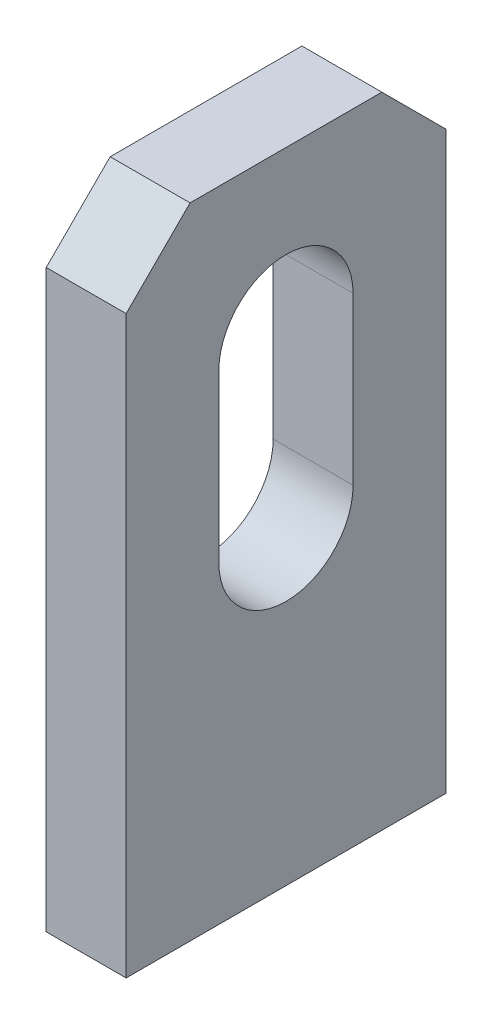
ISO-10303-21;
HEADER;
FILE_DESCRIPTION(('STEP AP214'),'2;1');
FILE_NAME('part.step','',(''),(''),'','','');
FILE_SCHEMA(('AUTOMOTIVE_DESIGN { 1 0 10303 214 1 1 1 1 }'));
ENDSEC;
DATA;
#1=APPLICATION_CONTEXT('core data for automotive mechanical design processes');
#2=APPLICATION_PROTOCOL_DEFINITION('international standard','automotive_design',2000,#1);
#3=PRODUCT_CONTEXT('',#1,'mechanical');
#4=PRODUCT('Part','Part','',(#3));
#5=PRODUCT_RELATED_PRODUCT_CATEGORY('part','',(#4));
#6=PRODUCT_DEFINITION_FORMATION('','',#4);
#7=PRODUCT_DEFINITION_CONTEXT('part definition',#1,'design');
#8=PRODUCT_DEFINITION('design','',#6,#7);
#9=PRODUCT_DEFINITION_SHAPE('','',#8);
#10=(LENGTH_UNIT() NAMED_UNIT(*) SI_UNIT(.MILLI.,.METRE.));
#11=(NAMED_UNIT(*) PLANE_ANGLE_UNIT() SI_UNIT($,.RADIAN.));
#12=(NAMED_UNIT(*) SI_UNIT($,.STERADIAN.) SOLID_ANGLE_UNIT());
#13=UNCERTAINTY_MEASURE_WITH_UNIT(LENGTH_MEASURE(1.E-05),#10,'distance_accuracy_value','');
#14=(GEOMETRIC_REPRESENTATION_CONTEXT(3) GLOBAL_UNCERTAINTY_ASSIGNED_CONTEXT((#13)) GLOBAL_UNIT_ASSIGNED_CONTEXT((#10,
#11,#12)) REPRESENTATION_CONTEXT('',''));
#15=CARTESIAN_POINT('',(0.,0.,0.));
#16=DIRECTION('',(0.,0.,1.));
#17=DIRECTION('',(1.,0.,0.));
#18=AXIS2_PLACEMENT_3D('',#15,#16,#17);
#19=CARTESIAN_POINT('',(-0.2,0.,1.));
#20=DIRECTION('',(-1.,0.,0.));
#21=DIRECTION('',(0.,0.,1.));
#22=AXIS2_PLACEMENT_3D('',#19,#20,#21);
#23=PLANE('',#22);
#24=CARTESIAN_POINT('',(-0.2,3.00000007524848,0.));
#25=DIRECTION('',(1.,0.,0.));
#26=DIRECTION('',(0.,0.,-1.));
#27=AXIS2_PLACEMENT_3D('',#24,#25,#26);
#28=CIRCLE('',#27,0.419999999999999);
#29=CARTESIAN_POINT('',(-0.2,3.00000007524848,-0.419999999999999));
#30=VERTEX_POINT('',#29);
#31=CARTESIAN_POINT('',(-0.2,3.00000007518949,0.419999999999999));
#32=VERTEX_POINT('',#31);
#33=EDGE_CURVE('E126',#30,#32,#28,.T.);
#34=ORIENTED_EDGE('',*,*,#33,.T.);
#35=DIRECTION('',(0.,1.,0.));
#36=VECTOR('',#35,1.);
#37=CARTESIAN_POINT('',(-0.2,1.96011627906977,0.42));
#38=LINE('',#37,#36);
#39=CARTESIAN_POINT('',(-0.2,1.96011627906977,0.42));
#40=VERTEX_POINT('',#39);
#41=EDGE_CURVE('E59',#32,#40,#38,.F.);
#42=ORIENTED_EDGE('',*,*,#41,.T.);
#43=CARTESIAN_POINT('',(-0.2,1.96011627906977,0.));
#44=DIRECTION('',(1.,0.,0.));
#45=DIRECTION('',(0.,0.,-1.));
#46=AXIS2_PLACEMENT_3D('',#43,#44,#45);
#47=CIRCLE('',#46,0.42);
#48=CARTESIAN_POINT('',(-0.2,1.96011627906977,-0.419999999999999));
#49=VERTEX_POINT('',#48);
#50=EDGE_CURVE('E19',#40,#49,#47,.T.);
#51=ORIENTED_EDGE('',*,*,#50,.T.);
#52=DIRECTION('',(0.,1.,0.));
#53=VECTOR('',#52,1.);
#54=CARTESIAN_POINT('',(-0.2,3.00000007524848,-0.419999999999999));
#55=LINE('',#54,#53);
#56=EDGE_CURVE('E115',#49,#30,#55,.T.);
#57=ORIENTED_EDGE('',*,*,#56,.T.);
#58=EDGE_LOOP('',(#34,#42,#51,#57));
#59=FACE_BOUND('',#58,.T.);
#60=DIRECTION('',(0.,0.707106781186553,-0.707106781186542));
#61=VECTOR('',#60,1.);
#62=CARTESIAN_POINT('',(-0.2,4.,0.6));
#63=LINE('',#62,#61);
#64=CARTESIAN_POINT('',(-0.2,3.59999999999999,1.));
#65=VERTEX_POINT('',#64);
#66=CARTESIAN_POINT('',(-0.2,4.,0.6));
#67=VERTEX_POINT('',#66);
#68=EDGE_CURVE('E103',#65,#67,#63,.T.);
#69=ORIENTED_EDGE('',*,*,#68,.T.);
#70=DIRECTION('',(0.,0.,1.));
#71=VECTOR('',#70,1.);
#72=CARTESIAN_POINT('',(-0.2,4.,0.));
#73=LINE('',#72,#71);
#74=CARTESIAN_POINT('',(-0.2,4.,-0.6));
#75=VERTEX_POINT('',#74);
#76=EDGE_CURVE('E101',#75,#67,#73,.T.);
#77=ORIENTED_EDGE('',*,*,#76,.F.);
#78=DIRECTION('',(0.,-0.707106781186548,-0.707106781186547));
#79=VECTOR('',#78,1.);
#80=CARTESIAN_POINT('',(-0.2,3.6,-1.));
#81=LINE('',#80,#79);
#82=CARTESIAN_POINT('',(-0.2,3.6,-1.));
#83=VERTEX_POINT('',#82);
#84=EDGE_CURVE('E88',#75,#83,#81,.T.);
#85=ORIENTED_EDGE('',*,*,#84,.T.);
#86=DIRECTION('',(0.,1.,0.));
#87=VECTOR('',#86,1.);
#88=CARTESIAN_POINT('',(-0.200000000000001,0.,-1.));
#89=LINE('',#88,#87);
#90=CARTESIAN_POINT('',(-0.200000000000001,0.,-1.));
#91=VERTEX_POINT('',#90);
#92=EDGE_CURVE('E135',#91,#83,#89,.T.);
#93=ORIENTED_EDGE('',*,*,#92,.F.);
#94=DIRECTION('',(0.,0.,1.));
#95=VECTOR('',#94,1.);
#96=CARTESIAN_POINT('',(-0.200000000000001,0.,0.));
#97=LINE('',#96,#95);
#98=CARTESIAN_POINT('',(-0.2,0.,1.));
#99=VERTEX_POINT('',#98);
#100=EDGE_CURVE('E68',#91,#99,#97,.T.);
#101=ORIENTED_EDGE('',*,*,#100,.T.);
#102=DIRECTION('',(0.,1.,0.));
#103=VECTOR('',#102,1.);
#104=CARTESIAN_POINT('',(-0.2,0.,1.));
#105=LINE('',#104,#103);
#106=EDGE_CURVE('E145',#65,#99,#105,.F.);
#107=ORIENTED_EDGE('',*,*,#106,.F.);
#108=EDGE_LOOP('',(#69,#77,#85,#93,#101,#107));
#109=FACE_BOUND('',#108,.T.);
#110=ADVANCED_FACE('F16',(#59,#109),#23,.T.);
#111=CARTESIAN_POINT('',(-0.200000000000001,3.6,-1.));
#112=DIRECTION('',(0.,-0.707106781186547,0.707106781186548));
#113=DIRECTION('',(0.,-0.707106781186548,-0.707106781186547));
#114=AXIS2_PLACEMENT_3D('',#111,#112,#113);
#115=PLANE('',#114);
#116=DIRECTION('',(-1.,0.,0.));
#117=VECTOR('',#116,1.);
#118=CARTESIAN_POINT('',(-0.200000000000001,3.6,-1.));
#119=LINE('',#118,#117);
#120=CARTESIAN_POINT('',(0.3,3.6,-1.));
#121=VERTEX_POINT('',#120);
#122=EDGE_CURVE('E96',#83,#121,#119,.F.);
#123=ORIENTED_EDGE('',*,*,#122,.F.);
#124=ORIENTED_EDGE('',*,*,#84,.F.);
#125=DIRECTION('',(1.,0.,0.));
#126=VECTOR('',#125,1.);
#127=CARTESIAN_POINT('',(0.05,4.,-0.6));
#128=LINE('',#127,#126);
#129=CARTESIAN_POINT('',(0.3,4.,-0.6));
#130=VERTEX_POINT('',#129);
#131=EDGE_CURVE('E93',#130,#75,#128,.F.);
#132=ORIENTED_EDGE('',*,*,#131,.F.);
#133=DIRECTION('',(0.,0.707106781186547,0.707106781186548));
#134=VECTOR('',#133,1.);
#135=CARTESIAN_POINT('',(0.3,3.6,-1.));
#136=LINE('',#135,#134);
#137=EDGE_CURVE('E169',#121,#130,#136,.T.);
#138=ORIENTED_EDGE('',*,*,#137,.F.);
#139=EDGE_LOOP('',(#123,#124,#132,#138));
#140=FACE_BOUND('',#139,.T.);
#141=ADVANCED_FACE('F90',(#140),#115,.F.);
#142=CARTESIAN_POINT('',(0.05,4.,0.));
#143=DIRECTION('',(0.,1.,0.));
#144=DIRECTION('',(0.,0.,1.));
#145=AXIS2_PLACEMENT_3D('',#142,#143,#144);
#146=PLANE('',#145);
#147=DIRECTION('',(1.,0.,0.));
#148=VECTOR('',#147,1.);
#149=CARTESIAN_POINT('',(-0.2,4.,0.6));
#150=LINE('',#149,#148);
#151=CARTESIAN_POINT('',(0.3,4.,0.6));
#152=VERTEX_POINT('',#151);
#153=EDGE_CURVE('E151',#67,#152,#150,.T.);
#154=ORIENTED_EDGE('',*,*,#153,.T.);
#155=DIRECTION('',(0.,0.,-1.));
#156=VECTOR('',#155,1.);
#157=CARTESIAN_POINT('',(0.3,4.,-1.));
#158=LINE('',#157,#156);
#159=EDGE_CURVE('E110',#130,#152,#158,.F.);
#160=ORIENTED_EDGE('',*,*,#159,.F.);
#161=ORIENTED_EDGE('',*,*,#131,.T.);
#162=ORIENTED_EDGE('',*,*,#76,.T.);
#163=EDGE_LOOP('',(#154,#160,#161,#162));
#164=FACE_BOUND('',#163,.T.);
#165=ADVANCED_FACE('F108',(#164),#146,.T.);
#166=CARTESIAN_POINT('',(-0.2,4.,0.6));
#167=DIRECTION('',(0.,-0.707106781186542,-0.707106781186553));
#168=DIRECTION('',(0.,0.707106781186553,-0.707106781186542));
#169=AXIS2_PLACEMENT_3D('',#166,#167,#168);
#170=PLANE('',#169);
#171=ORIENTED_EDGE('',*,*,#153,.F.);
#172=ORIENTED_EDGE('',*,*,#68,.F.);
#173=DIRECTION('',(1.,0.,0.));
#174=VECTOR('',#173,1.);
#175=CARTESIAN_POINT('',(0.3,3.59999999999999,1.));
#176=LINE('',#175,#174);
#177=CARTESIAN_POINT('',(0.3,3.59999999999999,1.));
#178=VERTEX_POINT('',#177);
#179=EDGE_CURVE('E148',#178,#65,#176,.F.);
#180=ORIENTED_EDGE('',*,*,#179,.F.);
#181=DIRECTION('',(0.,-0.707106781186553,0.707106781186542));
#182=VECTOR('',#181,1.);
#183=CARTESIAN_POINT('',(0.3,4.,0.6));
#184=LINE('',#183,#182);
#185=EDGE_CURVE('E159',#152,#178,#184,.T.);
#186=ORIENTED_EDGE('',*,*,#185,.F.);
#187=EDGE_LOOP('',(#171,#172,#180,#186));
#188=FACE_BOUND('',#187,.T.);
#189=ADVANCED_FACE('F160',(#188),#170,.F.);
#190=CARTESIAN_POINT('',(0.3,0.,1.));
#191=DIRECTION('',(0.,0.,1.));
#192=DIRECTION('',(1.,0.,0.));
#193=AXIS2_PLACEMENT_3D('',#190,#191,#192);
#194=PLANE('',#193);
#195=DIRECTION('',(1.,0.,0.));
#196=VECTOR('',#195,1.);
#197=CARTESIAN_POINT('',(0.05,0.,1.));
#198=LINE('',#197,#196);
#199=CARTESIAN_POINT('',(0.3,0.,1.));
#200=VERTEX_POINT('',#199);
#201=EDGE_CURVE('E141',#99,#200,#198,.T.);
#202=ORIENTED_EDGE('',*,*,#201,.T.);
#203=DIRECTION('',(0.,1.,0.));
#204=VECTOR('',#203,1.);
#205=CARTESIAN_POINT('',(0.3,0.,1.));
#206=LINE('',#205,#204);
#207=EDGE_CURVE('E164',#178,#200,#206,.F.);
#208=ORIENTED_EDGE('',*,*,#207,.F.);
#209=ORIENTED_EDGE('',*,*,#179,.T.);
#210=ORIENTED_EDGE('',*,*,#106,.T.);
#211=EDGE_LOOP('',(#202,#208,#209,#210));
#212=FACE_BOUND('',#211,.T.);
#213=ADVANCED_FACE('F208',(#212),#194,.T.);
#214=CARTESIAN_POINT('',(0.05,0.,0.));
#215=DIRECTION('',(0.,1.,0.));
#216=DIRECTION('',(0.,0.,1.));
#217=AXIS2_PLACEMENT_3D('',#214,#215,#216);
#218=PLANE('',#217);
#219=ORIENTED_EDGE('',*,*,#100,.F.);
#220=DIRECTION('',(-1.,0.,0.));
#221=VECTOR('',#220,1.);
#222=CARTESIAN_POINT('',(-0.200000000000001,0.,-1.));
#223=LINE('',#222,#221);
#224=CARTESIAN_POINT('',(0.3,0.,-1.));
#225=VERTEX_POINT('',#224);
#226=EDGE_CURVE('E137',#225,#91,#223,.T.);
#227=ORIENTED_EDGE('',*,*,#226,.F.);
#228=DIRECTION('',(0.,0.,-1.));
#229=VECTOR('',#228,1.);
#230=CARTESIAN_POINT('',(0.3,0.,-1.));
#231=LINE('',#230,#229);
#232=EDGE_CURVE('E297',#200,#225,#231,.T.);
#233=ORIENTED_EDGE('',*,*,#232,.F.);
#234=ORIENTED_EDGE('',*,*,#201,.F.);
#235=EDGE_LOOP('',(#219,#227,#233,#234));
#236=FACE_BOUND('',#235,.T.);
#237=ADVANCED_FACE('F204',(#236),#218,.F.);
#238=CARTESIAN_POINT('',(-0.200000000000001,0.,-1.));
#239=DIRECTION('',(0.,0.,-1.));
#240=DIRECTION('',(-1.,0.,0.));
#241=AXIS2_PLACEMENT_3D('',#238,#239,#240);
#242=PLANE('',#241);
#243=ORIENTED_EDGE('',*,*,#226,.T.);
#244=ORIENTED_EDGE('',*,*,#92,.T.);
#245=ORIENTED_EDGE('',*,*,#122,.T.);
#246=DIRECTION('',(0.,1.,0.));
#247=VECTOR('',#246,1.);
#248=CARTESIAN_POINT('',(0.3,0.,-1.));
#249=LINE('',#248,#247);
#250=EDGE_CURVE('E125',#225,#121,#249,.T.);
#251=ORIENTED_EDGE('',*,*,#250,.F.);
#252=EDGE_LOOP('',(#243,#244,#245,#251));
#253=FACE_BOUND('',#252,.T.);
#254=ADVANCED_FACE('F201',(#253),#242,.T.);
#255=CARTESIAN_POINT('',(-0.2,1.96011627906977,0.));
#256=DIRECTION('',(1.,0.,0.));
#257=DIRECTION('',(0.,0.,-1.));
#258=AXIS2_PLACEMENT_3D('',#255,#256,#257);
#259=CYLINDRICAL_SURFACE('',#258,0.42);
#260=DIRECTION('',(-1.,0.,0.));
#261=VECTOR('',#260,1.);
#262=CARTESIAN_POINT('',(-0.2,1.96011627906977,-0.419999999999999));
#263=LINE('',#262,#261);
#264=CARTESIAN_POINT('',(0.3,1.96011627906977,-0.419999999999999));
#265=VERTEX_POINT('',#264);
#266=EDGE_CURVE('E117',#265,#49,#263,.T.);
#267=ORIENTED_EDGE('',*,*,#266,.T.);
#268=ORIENTED_EDGE('',*,*,#50,.F.);
#269=DIRECTION('',(1.,0.,0.));
#270=VECTOR('',#269,1.);
#271=CARTESIAN_POINT('',(-0.2,1.96011627906977,0.42));
#272=LINE('',#271,#270);
#273=CARTESIAN_POINT('',(0.3,1.96011627906977,0.419999999999999));
#274=VERTEX_POINT('',#273);
#275=EDGE_CURVE('E119',#40,#274,#272,.T.);
#276=ORIENTED_EDGE('',*,*,#275,.T.);
#277=CARTESIAN_POINT('',(0.3,1.96011627906977,0.));
#278=DIRECTION('',(1.,0.,0.));
#279=DIRECTION('',(0.,0.,-1.));
#280=AXIS2_PLACEMENT_3D('',#277,#278,#279);
#281=CIRCLE('',#280,0.42);
#282=EDGE_CURVE('E123',#265,#274,#281,.F.);
#283=ORIENTED_EDGE('',*,*,#282,.F.);
#284=EDGE_LOOP('',(#267,#268,#276,#283));
#285=FACE_BOUND('',#284,.T.);
#286=ADVANCED_FACE('F177',(#285),#259,.F.);
#287=CARTESIAN_POINT('',(-0.2,1.96011627906977,0.42));
#288=DIRECTION('',(0.,0.,1.));
#289=DIRECTION('',(1.,0.,0.));
#290=AXIS2_PLACEMENT_3D('',#287,#288,#289);
#291=PLANE('',#290);
#292=ORIENTED_EDGE('',*,*,#275,.F.);
#293=ORIENTED_EDGE('',*,*,#41,.F.);
#294=DIRECTION('',(1.,0.,0.));
#295=VECTOR('',#294,1.);
#296=CARTESIAN_POINT('',(-0.2,3.0000000751305,0.419999999999999));
#297=LINE('',#296,#295);
#298=CARTESIAN_POINT('',(0.3,3.00000007518949,0.419999999999999));
#299=VERTEX_POINT('',#298);
#300=EDGE_CURVE('E127',#32,#299,#297,.T.);
#301=ORIENTED_EDGE('',*,*,#300,.T.);
#302=DIRECTION('',(0.,1.,0.));
#303=VECTOR('',#302,1.);
#304=CARTESIAN_POINT('',(0.3,0.,0.419999999999999));
#305=LINE('',#304,#303);
#306=EDGE_CURVE('E122',#274,#299,#305,.T.);
#307=ORIENTED_EDGE('',*,*,#306,.F.);
#308=EDGE_LOOP('',(#292,#293,#301,#307));
#309=FACE_BOUND('',#308,.T.);
#310=ADVANCED_FACE('F184',(#309),#291,.F.);
#311=CARTESIAN_POINT('',(-0.2,3.00000007524848,0.));
#312=DIRECTION('',(1.,0.,0.));
#313=DIRECTION('',(0.,0.,-1.));
#314=AXIS2_PLACEMENT_3D('',#311,#312,#313);
#315=CYLINDRICAL_SURFACE('',#314,0.419999999999999);
#316=ORIENTED_EDGE('',*,*,#300,.F.);
#317=ORIENTED_EDGE('',*,*,#33,.F.);
#318=DIRECTION('',(-1.,0.,0.));
#319=VECTOR('',#318,1.);
#320=CARTESIAN_POINT('',(-0.2,3.00000007524848,-0.419999999999999));
#321=LINE('',#320,#319);
#322=CARTESIAN_POINT('',(0.3,3.00000007524848,-0.419999999999999));
#323=VERTEX_POINT('',#322);
#324=EDGE_CURVE('E34',#30,#323,#321,.F.);
#325=ORIENTED_EDGE('',*,*,#324,.T.);
#326=CARTESIAN_POINT('',(0.3,3.00000007524848,0.));
#327=DIRECTION('',(1.,0.,0.));
#328=DIRECTION('',(0.,0.,-1.));
#329=AXIS2_PLACEMENT_3D('',#326,#327,#328);
#330=CIRCLE('',#329,0.419999999999999);
#331=EDGE_CURVE('E25',#299,#323,#330,.F.);
#332=ORIENTED_EDGE('',*,*,#331,.F.);
#333=EDGE_LOOP('',(#316,#317,#325,#332));
#334=FACE_BOUND('',#333,.T.);
#335=ADVANCED_FACE('F181',(#334),#315,.F.);
#336=CARTESIAN_POINT('',(-0.2,3.00000007524848,-0.419999999999999));
#337=DIRECTION('',(0.,0.,-1.));
#338=DIRECTION('',(-1.,0.,0.));
#339=AXIS2_PLACEMENT_3D('',#336,#337,#338);
#340=PLANE('',#339);
#341=ORIENTED_EDGE('',*,*,#324,.F.);
#342=ORIENTED_EDGE('',*,*,#56,.F.);
#343=ORIENTED_EDGE('',*,*,#266,.F.);
#344=DIRECTION('',(0.,1.,0.));
#345=VECTOR('',#344,1.);
#346=CARTESIAN_POINT('',(0.3,0.,-0.42));
#347=LINE('',#346,#345);
#348=EDGE_CURVE('E11',#323,#265,#347,.F.);
#349=ORIENTED_EDGE('',*,*,#348,.F.);
#350=EDGE_LOOP('',(#341,#342,#343,#349));
#351=FACE_BOUND('',#350,.T.);
#352=ADVANCED_FACE('F179',(#351),#340,.F.);
#353=CARTESIAN_POINT('',(0.3,0.,-1.));
#354=DIRECTION('',(1.,0.,0.));
#355=DIRECTION('',(0.,0.,-1.));
#356=AXIS2_PLACEMENT_3D('',#353,#354,#355);
#357=PLANE('',#356);
#358=ORIENTED_EDGE('',*,*,#331,.T.);
#359=ORIENTED_EDGE('',*,*,#348,.T.);
#360=ORIENTED_EDGE('',*,*,#282,.T.);
#361=ORIENTED_EDGE('',*,*,#306,.T.);
#362=EDGE_LOOP('',(#358,#359,#360,#361));
#363=FACE_BOUND('',#362,.T.);
#364=ORIENTED_EDGE('',*,*,#232,.T.);
#365=ORIENTED_EDGE('',*,*,#250,.T.);
#366=ORIENTED_EDGE('',*,*,#137,.T.);
#367=ORIENTED_EDGE('',*,*,#159,.T.);
#368=ORIENTED_EDGE('',*,*,#185,.T.);
#369=ORIENTED_EDGE('',*,*,#207,.T.);
#370=EDGE_LOOP('',(#364,#365,#366,#367,#368,#369));
#371=FACE_BOUND('',#370,.T.);
#372=ADVANCED_FACE('F167',(#363,#371),#357,.T.);
#373=CLOSED_SHELL('',(#110,#141,#165,#189,#213,#237,#254,#286,#310,#335,#352,#372));
#374=MANIFOLD_SOLID_BREP('B1',#373);
#375=ADVANCED_BREP_SHAPE_REPRESENTATION('',(#18,#374),#14);
#376=SHAPE_DEFINITION_REPRESENTATION(#9,#375);
ENDSEC;
END-ISO-10303-21;
